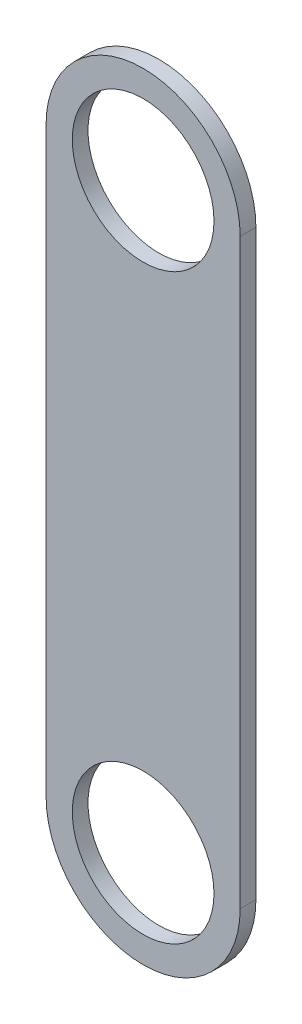
ISO-10303-21;
HEADER;
FILE_DESCRIPTION(('STEP AP214'),'2;1');
FILE_NAME('part.step','',(''),(''),'','','');
FILE_SCHEMA(('AUTOMOTIVE_DESIGN { 1 0 10303 214 1 1 1 1 }'));
ENDSEC;
DATA;
#1=APPLICATION_CONTEXT('core data for automotive mechanical design processes');
#2=APPLICATION_PROTOCOL_DEFINITION('international standard','automotive_design',2000,#1);
#3=PRODUCT_CONTEXT('',#1,'mechanical');
#4=PRODUCT('Part','Part','',(#3));
#5=PRODUCT_RELATED_PRODUCT_CATEGORY('part','',(#4));
#6=PRODUCT_DEFINITION_FORMATION('','',#4);
#7=PRODUCT_DEFINITION_CONTEXT('part definition',#1,'design');
#8=PRODUCT_DEFINITION('design','',#6,#7);
#9=PRODUCT_DEFINITION_SHAPE('','',#8);
#10=(LENGTH_UNIT() NAMED_UNIT(*) SI_UNIT(.MILLI.,.METRE.));
#11=(NAMED_UNIT(*) PLANE_ANGLE_UNIT() SI_UNIT($,.RADIAN.));
#12=(NAMED_UNIT(*) SI_UNIT($,.STERADIAN.) SOLID_ANGLE_UNIT());
#13=UNCERTAINTY_MEASURE_WITH_UNIT(LENGTH_MEASURE(1.E-05),#10,'distance_accuracy_value','');
#14=(GEOMETRIC_REPRESENTATION_CONTEXT(3) GLOBAL_UNCERTAINTY_ASSIGNED_CONTEXT((#13)) GLOBAL_UNIT_ASSIGNED_CONTEXT((#10,
#11,#12)) REPRESENTATION_CONTEXT('',''));
#15=CARTESIAN_POINT('',(0.,0.,0.));
#16=DIRECTION('',(0.,0.,1.));
#17=DIRECTION('',(1.,0.,0.));
#18=AXIS2_PLACEMENT_3D('',#15,#16,#17);
#19=CARTESIAN_POINT('',(12.7,0.,2.0574));
#20=DIRECTION('',(0.,0.,1.));
#21=DIRECTION('',(1.,0.,0.));
#22=AXIS2_PLACEMENT_3D('',#19,#20,#21);
#23=PLANE('',#22);
#24=CARTESIAN_POINT('',(12.7,0.,2.0574));
#25=DIRECTION('',(0.,0.,1.));
#26=DIRECTION('',(1.,0.,0.));
#27=AXIS2_PLACEMENT_3D('',#24,#25,#26);
#28=CIRCLE('',#27,9.271);
#29=CARTESIAN_POINT('',(21.971,0.,2.0574));
#30=VERTEX_POINT('',#29);
#31=EDGE_CURVE('E118',#30,#30,#28,.T.);
#32=ORIENTED_EDGE('',*,*,#31,.F.);
#33=EDGE_LOOP('',(#32));
#34=FACE_BOUND('',#33,.T.);
#35=CARTESIAN_POINT('',(12.7,0.,2.0574));
#36=DIRECTION('',(0.,0.,1.));
#37=DIRECTION('',(1.,0.,0.));
#38=AXIS2_PLACEMENT_3D('',#35,#36,#37);
#39=CIRCLE('',#38,12.7);
#40=CARTESIAN_POINT('',(0.,0.,2.0574));
#41=VERTEX_POINT('',#40);
#42=CARTESIAN_POINT('',(25.4,0.,2.0574));
#43=VERTEX_POINT('',#42);
#44=EDGE_CURVE('E98',#41,#43,#39,.T.);
#45=ORIENTED_EDGE('',*,*,#44,.T.);
#46=DIRECTION('',(0.,1.,0.));
#47=VECTOR('',#46,1.);
#48=CARTESIAN_POINT('',(25.4,0.,2.0574));
#49=LINE('',#48,#47);
#50=CARTESIAN_POINT('',(25.4,76.2,2.0574));
#51=VERTEX_POINT('',#50);
#52=EDGE_CURVE('E93',#43,#51,#49,.T.);
#53=ORIENTED_EDGE('',*,*,#52,.T.);
#54=CARTESIAN_POINT('',(12.7,76.2,2.0574));
#55=DIRECTION('',(0.,0.,1.));
#56=DIRECTION('',(1.,0.,0.));
#57=AXIS2_PLACEMENT_3D('',#54,#55,#56);
#58=CIRCLE('',#57,12.7);
#59=CARTESIAN_POINT('',(0.,76.2,2.0574));
#60=VERTEX_POINT('',#59);
#61=EDGE_CURVE('E96',#51,#60,#58,.T.);
#62=ORIENTED_EDGE('',*,*,#61,.T.);
#63=DIRECTION('',(0.,-1.,0.));
#64=VECTOR('',#63,1.);
#65=CARTESIAN_POINT('',(0.,0.,2.0574));
#66=LINE('',#65,#64);
#67=EDGE_CURVE('E63',#60,#41,#66,.T.);
#68=ORIENTED_EDGE('',*,*,#67,.T.);
#69=EDGE_LOOP('',(#45,#53,#62,#68));
#70=FACE_BOUND('',#69,.T.);
#71=CARTESIAN_POINT('',(12.7,76.2,2.0574));
#72=DIRECTION('',(0.,0.,1.));
#73=DIRECTION('',(1.,0.,0.));
#74=AXIS2_PLACEMENT_3D('',#71,#72,#73);
#75=CIRCLE('',#74,9.271);
#76=CARTESIAN_POINT('',(21.971,76.2,2.0574));
#77=VERTEX_POINT('',#76);
#78=EDGE_CURVE('E140',#77,#77,#75,.T.);
#79=ORIENTED_EDGE('',*,*,#78,.F.);
#80=EDGE_LOOP('',(#79));
#81=FACE_BOUND('',#80,.T.);
#82=ADVANCED_FACE('F45',(#34,#70,#81),#23,.T.);
#83=CARTESIAN_POINT('',(12.7,0.,0.));
#84=DIRECTION('',(0.,0.,1.));
#85=DIRECTION('',(1.,0.,0.));
#86=AXIS2_PLACEMENT_3D('',#83,#84,#85);
#87=PLANE('',#86);
#88=CARTESIAN_POINT('',(12.7,0.,0.));
#89=DIRECTION('',(0.,0.,1.));
#90=DIRECTION('',(1.,0.,0.));
#91=AXIS2_PLACEMENT_3D('',#88,#89,#90);
#92=CIRCLE('',#91,12.7);
#93=CARTESIAN_POINT('',(0.,0.,0.));
#94=VERTEX_POINT('',#93);
#95=CARTESIAN_POINT('',(25.4,0.,0.));
#96=VERTEX_POINT('',#95);
#97=EDGE_CURVE('E114',#94,#96,#92,.T.);
#98=ORIENTED_EDGE('',*,*,#97,.F.);
#99=DIRECTION('',(0.,-1.,0.));
#100=VECTOR('',#99,1.);
#101=CARTESIAN_POINT('',(0.,0.,0.));
#102=LINE('',#101,#100);
#103=CARTESIAN_POINT('',(0.,76.2,0.));
#104=VERTEX_POINT('',#103);
#105=EDGE_CURVE('E86',#104,#94,#102,.T.);
#106=ORIENTED_EDGE('',*,*,#105,.F.);
#107=CARTESIAN_POINT('',(12.7,76.2,0.));
#108=DIRECTION('',(0.,0.,1.));
#109=DIRECTION('',(1.,0.,0.));
#110=AXIS2_PLACEMENT_3D('',#107,#108,#109);
#111=CIRCLE('',#110,12.7);
#112=CARTESIAN_POINT('',(25.4,76.2,0.));
#113=VERTEX_POINT('',#112);
#114=EDGE_CURVE('E80',#113,#104,#111,.T.);
#115=ORIENTED_EDGE('',*,*,#114,.F.);
#116=DIRECTION('',(0.,1.,0.));
#117=VECTOR('',#116,1.);
#118=CARTESIAN_POINT('',(25.4,0.,0.));
#119=LINE('',#118,#117);
#120=EDGE_CURVE('E103',#96,#113,#119,.T.);
#121=ORIENTED_EDGE('',*,*,#120,.F.);
#122=EDGE_LOOP('',(#98,#106,#115,#121));
#123=FACE_BOUND('',#122,.T.);
#124=CARTESIAN_POINT('',(12.7,0.,0.));
#125=DIRECTION('',(0.,0.,1.));
#126=DIRECTION('',(1.,0.,0.));
#127=AXIS2_PLACEMENT_3D('',#124,#125,#126);
#128=CIRCLE('',#127,9.271);
#129=CARTESIAN_POINT('',(21.971,0.,0.));
#130=VERTEX_POINT('',#129);
#131=EDGE_CURVE('E136',#130,#130,#128,.T.);
#132=ORIENTED_EDGE('',*,*,#131,.T.);
#133=EDGE_LOOP('',(#132));
#134=FACE_BOUND('',#133,.T.);
#135=CARTESIAN_POINT('',(12.7,76.2,0.));
#136=DIRECTION('',(0.,0.,1.));
#137=DIRECTION('',(1.,0.,0.));
#138=AXIS2_PLACEMENT_3D('',#135,#136,#137);
#139=CIRCLE('',#138,9.271);
#140=CARTESIAN_POINT('',(21.971,76.2,0.));
#141=VERTEX_POINT('',#140);
#142=EDGE_CURVE('E144',#141,#141,#139,.T.);
#143=ORIENTED_EDGE('',*,*,#142,.T.);
#144=EDGE_LOOP('',(#143));
#145=FACE_BOUND('',#144,.T.);
#146=ADVANCED_FACE('F131',(#123,#134,#145),#87,.F.);
#147=CARTESIAN_POINT('',(12.7,0.,2.0574));
#148=DIRECTION('',(0.,0.,-1.));
#149=DIRECTION('',(-1.,0.,0.));
#150=AXIS2_PLACEMENT_3D('',#147,#148,#149);
#151=CYLINDRICAL_SURFACE('',#150,12.7);
#152=ORIENTED_EDGE('',*,*,#97,.T.);
#153=DIRECTION('',(0.,0.,-1.));
#154=VECTOR('',#153,1.);
#155=CARTESIAN_POINT('',(25.4,0.,2.0574));
#156=LINE('',#155,#154);
#157=EDGE_CURVE('E11',#43,#96,#156,.T.);
#158=ORIENTED_EDGE('',*,*,#157,.F.);
#159=ORIENTED_EDGE('',*,*,#44,.F.);
#160=DIRECTION('',(0.,0.,-1.));
#161=VECTOR('',#160,1.);
#162=CARTESIAN_POINT('',(0.,0.,2.0574));
#163=LINE('',#162,#161);
#164=EDGE_CURVE('E110',#41,#94,#163,.T.);
#165=ORIENTED_EDGE('',*,*,#164,.T.);
#166=EDGE_LOOP('',(#152,#158,#159,#165));
#167=FACE_BOUND('',#166,.T.);
#168=ADVANCED_FACE('F47',(#167),#151,.T.);
#169=CARTESIAN_POINT('',(25.4,0.,2.0574));
#170=DIRECTION('',(-1.,0.,0.));
#171=DIRECTION('',(0.,-1.,0.));
#172=AXIS2_PLACEMENT_3D('',#169,#170,#171);
#173=PLANE('',#172);
#174=ORIENTED_EDGE('',*,*,#120,.T.);
#175=DIRECTION('',(0.,0.,-1.));
#176=VECTOR('',#175,1.);
#177=CARTESIAN_POINT('',(25.4,76.2,2.0574));
#178=LINE('',#177,#176);
#179=EDGE_CURVE('E55',#51,#113,#178,.T.);
#180=ORIENTED_EDGE('',*,*,#179,.F.);
#181=ORIENTED_EDGE('',*,*,#52,.F.);
#182=ORIENTED_EDGE('',*,*,#157,.T.);
#183=EDGE_LOOP('',(#174,#180,#181,#182));
#184=FACE_BOUND('',#183,.T.);
#185=ADVANCED_FACE('F102',(#184),#173,.F.);
#186=CARTESIAN_POINT('',(12.7,76.2,2.0574));
#187=DIRECTION('',(0.,0.,-1.));
#188=DIRECTION('',(-1.,0.,0.));
#189=AXIS2_PLACEMENT_3D('',#186,#187,#188);
#190=CYLINDRICAL_SURFACE('',#189,12.7);
#191=ORIENTED_EDGE('',*,*,#114,.T.);
#192=DIRECTION('',(0.,0.,-1.));
#193=VECTOR('',#192,1.);
#194=CARTESIAN_POINT('',(0.,76.2,2.0574));
#195=LINE('',#194,#193);
#196=EDGE_CURVE('E105',#60,#104,#195,.T.);
#197=ORIENTED_EDGE('',*,*,#196,.F.);
#198=ORIENTED_EDGE('',*,*,#61,.F.);
#199=ORIENTED_EDGE('',*,*,#179,.T.);
#200=EDGE_LOOP('',(#191,#197,#198,#199));
#201=FACE_BOUND('',#200,.T.);
#202=ADVANCED_FACE('F106',(#201),#190,.T.);
#203=CARTESIAN_POINT('',(0.,0.,2.0574));
#204=DIRECTION('',(1.,0.,0.));
#205=DIRECTION('',(0.,0.,-1.));
#206=AXIS2_PLACEMENT_3D('',#203,#204,#205);
#207=PLANE('',#206);
#208=ORIENTED_EDGE('',*,*,#105,.T.);
#209=ORIENTED_EDGE('',*,*,#164,.F.);
#210=ORIENTED_EDGE('',*,*,#67,.F.);
#211=ORIENTED_EDGE('',*,*,#196,.T.);
#212=EDGE_LOOP('',(#208,#209,#210,#211));
#213=FACE_BOUND('',#212,.T.);
#214=ADVANCED_FACE('F128',(#213),#207,.F.);
#215=CARTESIAN_POINT('',(12.7,0.,2.0574));
#216=DIRECTION('',(0.,0.,-1.));
#217=DIRECTION('',(-1.,0.,0.));
#218=AXIS2_PLACEMENT_3D('',#215,#216,#217);
#219=CYLINDRICAL_SURFACE('',#218,9.271);
#220=ORIENTED_EDGE('',*,*,#31,.T.);
#221=EDGE_LOOP('',(#220));
#222=FACE_BOUND('',#221,.T.);
#223=ORIENTED_EDGE('',*,*,#131,.F.);
#224=EDGE_LOOP('',(#223));
#225=FACE_BOUND('',#224,.T.);
#226=ADVANCED_FACE('F163',(#222,#225),#219,.F.);
#227=CARTESIAN_POINT('',(12.7,76.2,2.0574));
#228=DIRECTION('',(0.,0.,-1.));
#229=DIRECTION('',(-1.,0.,0.));
#230=AXIS2_PLACEMENT_3D('',#227,#228,#229);
#231=CYLINDRICAL_SURFACE('',#230,9.271);
#232=ORIENTED_EDGE('',*,*,#78,.T.);
#233=EDGE_LOOP('',(#232));
#234=FACE_BOUND('',#233,.T.);
#235=ORIENTED_EDGE('',*,*,#142,.F.);
#236=EDGE_LOOP('',(#235));
#237=FACE_BOUND('',#236,.T.);
#238=ADVANCED_FACE('F152',(#234,#237),#231,.F.);
#239=CLOSED_SHELL('',(#82,#146,#168,#185,#202,#214,#226,#238));
#240=MANIFOLD_SOLID_BREP('B2',#239);
#241=ADVANCED_BREP_SHAPE_REPRESENTATION('',(#18,#240),#14);
#242=SHAPE_DEFINITION_REPRESENTATION(#9,#241);
ENDSEC;
END-ISO-10303-21;
